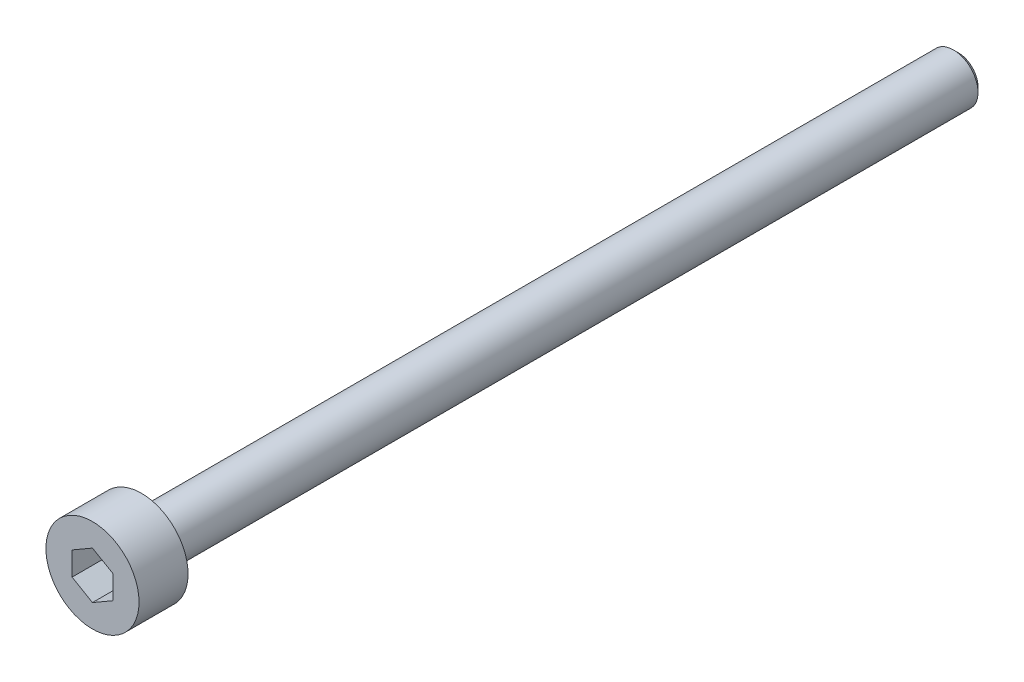
ISO-10303-21;
HEADER;
FILE_DESCRIPTION(('STEP AP214'),'2;1');
FILE_NAME('part.step','',(''),(''),'','','');
FILE_SCHEMA(('AUTOMOTIVE_DESIGN { 1 0 10303 214 1 1 1 1 }'));
ENDSEC;
DATA;
#1=APPLICATION_CONTEXT('core data for automotive mechanical design processes');
#2=APPLICATION_PROTOCOL_DEFINITION('international standard','automotive_design',2000,#1);
#3=PRODUCT_CONTEXT('',#1,'mechanical');
#4=PRODUCT('Part','Part','',(#3));
#5=PRODUCT_RELATED_PRODUCT_CATEGORY('part','',(#4));
#6=PRODUCT_DEFINITION_FORMATION('','',#4);
#7=PRODUCT_DEFINITION_CONTEXT('part definition',#1,'design');
#8=PRODUCT_DEFINITION('design','',#6,#7);
#9=PRODUCT_DEFINITION_SHAPE('','',#8);
#10=(LENGTH_UNIT() NAMED_UNIT(*) SI_UNIT(.MILLI.,.METRE.));
#11=(NAMED_UNIT(*) PLANE_ANGLE_UNIT() SI_UNIT($,.RADIAN.));
#12=(NAMED_UNIT(*) SI_UNIT($,.STERADIAN.) SOLID_ANGLE_UNIT());
#13=UNCERTAINTY_MEASURE_WITH_UNIT(LENGTH_MEASURE(1.E-05),#10,'distance_accuracy_value','');
#14=(GEOMETRIC_REPRESENTATION_CONTEXT(3) GLOBAL_UNCERTAINTY_ASSIGNED_CONTEXT((#13)) GLOBAL_UNIT_ASSIGNED_CONTEXT((#10,
#11,#12)) REPRESENTATION_CONTEXT('',''));
#15=CARTESIAN_POINT('',(0.,0.,0.));
#16=DIRECTION('',(0.,0.,1.));
#17=DIRECTION('',(1.,0.,0.));
#18=AXIS2_PLACEMENT_3D('',#15,#16,#17);
#19=CARTESIAN_POINT('',(0.,0.,3.));
#20=DIRECTION('',(0.,0.,-1.));
#21=DIRECTION('',(-1.,0.,0.));
#22=AXIS2_PLACEMENT_3D('',#19,#20,#21);
#23=CYLINDRICAL_SURFACE('',#22,2.85);
#24=CARTESIAN_POINT('',(0.,0.,3.));
#25=DIRECTION('',(0.,0.,1.));
#26=DIRECTION('',(1.,0.,0.));
#27=AXIS2_PLACEMENT_3D('',#24,#25,#26);
#28=CIRCLE('',#27,2.85);
#29=CARTESIAN_POINT('',(2.85,0.,3.));
#30=VERTEX_POINT('',#29);
#31=EDGE_CURVE('E146',#30,#30,#28,.T.);
#32=ORIENTED_EDGE('',*,*,#31,.F.);
#33=EDGE_LOOP('',(#32));
#34=FACE_BOUND('',#33,.T.);
#35=CARTESIAN_POINT('',(0.,0.,0.));
#36=DIRECTION('',(0.,0.,1.));
#37=DIRECTION('',(1.,0.,0.));
#38=AXIS2_PLACEMENT_3D('',#35,#36,#37);
#39=CIRCLE('',#38,2.85);
#40=CARTESIAN_POINT('',(2.85,0.,0.));
#41=VERTEX_POINT('',#40);
#42=EDGE_CURVE('E140',#41,#41,#39,.T.);
#43=ORIENTED_EDGE('',*,*,#42,.T.);
#44=EDGE_LOOP('',(#43));
#45=FACE_BOUND('',#44,.T.);
#46=ADVANCED_FACE('F38',(#34,#45),#23,.T.);
#47=CARTESIAN_POINT('',(0.,0.,3.));
#48=DIRECTION('',(0.,0.,1.));
#49=DIRECTION('',(1.,0.,0.));
#50=AXIS2_PLACEMENT_3D('',#47,#48,#49);
#51=PLANE('',#50);
#52=DIRECTION('',(-0.866025403784439,0.5,0.));
#53=VECTOR('',#52,1.);
#54=CARTESIAN_POINT('',(1.25,0.721687836487032,3.));
#55=LINE('',#54,#53);
#56=CARTESIAN_POINT('',(1.25,0.721687836487032,3.));
#57=VERTEX_POINT('',#56);
#58=CARTESIAN_POINT('',(0.,1.44337567297406,3.));
#59=VERTEX_POINT('',#58);
#60=EDGE_CURVE('E53',#57,#59,#55,.T.);
#61=ORIENTED_EDGE('',*,*,#60,.F.);
#62=DIRECTION('',(0.,1.,0.));
#63=VECTOR('',#62,1.);
#64=CARTESIAN_POINT('',(1.25,-0.721687836487032,3.));
#65=LINE('',#64,#63);
#66=CARTESIAN_POINT('',(1.25,-0.721687836487032,3.));
#67=VERTEX_POINT('',#66);
#68=EDGE_CURVE('E136',#67,#57,#65,.T.);
#69=ORIENTED_EDGE('',*,*,#68,.F.);
#70=DIRECTION('',(0.866025403784439,0.5,0.));
#71=VECTOR('',#70,1.);
#72=CARTESIAN_POINT('',(0.,-1.44337567297406,3.));
#73=LINE('',#72,#71);
#74=CARTESIAN_POINT('',(0.,-1.44337567297406,3.));
#75=VERTEX_POINT('',#74);
#76=EDGE_CURVE('E134',#75,#67,#73,.T.);
#77=ORIENTED_EDGE('',*,*,#76,.F.);
#78=DIRECTION('',(0.866025403784439,-0.5,0.));
#79=VECTOR('',#78,1.);
#80=CARTESIAN_POINT('',(-1.25,-0.721687836487033,3.));
#81=LINE('',#80,#79);
#82=CARTESIAN_POINT('',(-1.25,-0.721687836487033,3.));
#83=VERTEX_POINT('',#82);
#84=EDGE_CURVE('E101',#83,#75,#81,.T.);
#85=ORIENTED_EDGE('',*,*,#84,.F.);
#86=DIRECTION('',(0.,-1.,0.));
#87=VECTOR('',#86,1.);
#88=CARTESIAN_POINT('',(-1.25,0.721687836487032,3.));
#89=LINE('',#88,#87);
#90=CARTESIAN_POINT('',(-1.25,0.721687836487032,3.));
#91=VERTEX_POINT('',#90);
#92=EDGE_CURVE('E130',#91,#83,#89,.T.);
#93=ORIENTED_EDGE('',*,*,#92,.F.);
#94=DIRECTION('',(-0.866025403784439,-0.5,0.));
#95=VECTOR('',#94,1.);
#96=CARTESIAN_POINT('',(0.,1.44337567297406,3.));
#97=LINE('',#96,#95);
#98=EDGE_CURVE('E127',#59,#91,#97,.T.);
#99=ORIENTED_EDGE('',*,*,#98,.F.);
#100=EDGE_LOOP('',(#61,#69,#77,#85,#93,#99));
#101=FACE_BOUND('',#100,.T.);
#102=ORIENTED_EDGE('',*,*,#31,.T.);
#103=EDGE_LOOP('',(#102));
#104=FACE_BOUND('',#103,.T.);
#105=ADVANCED_FACE('F171',(#101,#104),#51,.T.);
#106=CARTESIAN_POINT('',(0.,0.,0.));
#107=DIRECTION('',(0.,0.,1.));
#108=DIRECTION('',(1.,0.,0.));
#109=AXIS2_PLACEMENT_3D('',#106,#107,#108);
#110=PLANE('',#109);
#111=CARTESIAN_POINT('',(0.,0.,0.));
#112=DIRECTION('',(0.,0.,1.));
#113=DIRECTION('',(1.,0.,0.));
#114=AXIS2_PLACEMENT_3D('',#111,#112,#113);
#115=CIRCLE('',#114,1.5);
#116=CARTESIAN_POINT('',(1.5,0.,0.));
#117=VERTEX_POINT('',#116);
#118=EDGE_CURVE('E149',#117,#117,#115,.F.);
#119=ORIENTED_EDGE('',*,*,#118,.F.);
#120=EDGE_LOOP('',(#119));
#121=FACE_BOUND('',#120,.T.);
#122=ORIENTED_EDGE('',*,*,#42,.F.);
#123=EDGE_LOOP('',(#122));
#124=FACE_BOUND('',#123,.T.);
#125=ADVANCED_FACE('F176',(#121,#124),#110,.F.);
#126=CARTESIAN_POINT('',(0.,0.,-50.));
#127=DIRECTION('',(0.,0.,1.));
#128=DIRECTION('',(1.,0.,0.));
#129=AXIS2_PLACEMENT_3D('',#126,#127,#128);
#130=CYLINDRICAL_SURFACE('',#129,1.5);
#131=CARTESIAN_POINT('',(0.,0.,-49.7));
#132=DIRECTION('',(0.,0.,-1.));
#133=DIRECTION('',(-1.,0.,0.));
#134=AXIS2_PLACEMENT_3D('',#131,#132,#133);
#135=CIRCLE('',#134,1.5);
#136=CARTESIAN_POINT('',(-1.5,0.,-49.7));
#137=VERTEX_POINT('',#136);
#138=EDGE_CURVE('E11',#137,#137,#135,.F.);
#139=ORIENTED_EDGE('',*,*,#138,.T.);
#140=EDGE_LOOP('',(#139));
#141=FACE_BOUND('',#140,.T.);
#142=ORIENTED_EDGE('',*,*,#118,.T.);
#143=EDGE_LOOP('',(#142));
#144=FACE_BOUND('',#143,.T.);
#145=ADVANCED_FACE('F167',(#141,#144),#130,.T.);
#146=CARTESIAN_POINT('',(0.,0.,-50.));
#147=DIRECTION('',(0.,0.,-1.));
#148=DIRECTION('',(-1.,0.,0.));
#149=AXIS2_PLACEMENT_3D('',#146,#147,#148);
#150=PLANE('',#149);
#151=CARTESIAN_POINT('',(0.,0.,-50.));
#152=DIRECTION('',(0.,0.,-1.));
#153=DIRECTION('',(-1.,0.,0.));
#154=AXIS2_PLACEMENT_3D('',#151,#152,#153);
#155=CIRCLE('',#154,1.2);
#156=CARTESIAN_POINT('',(-1.2,0.,-50.));
#157=VERTEX_POINT('',#156);
#158=EDGE_CURVE('E46',#157,#157,#155,.T.);
#159=ORIENTED_EDGE('',*,*,#158,.T.);
#160=EDGE_LOOP('',(#159));
#161=FACE_BOUND('',#160,.T.);
#162=ADVANCED_FACE('F156',(#161),#150,.T.);
#163=CARTESIAN_POINT('',(0.,0.,-50.));
#164=DIRECTION('',(0.,0.,1.));
#165=DIRECTION('',(1.,0.,0.));
#166=AXIS2_PLACEMENT_3D('',#163,#164,#165);
#167=CONICAL_SURFACE('',#166,1.2,0.785398163397447);
#168=ORIENTED_EDGE('',*,*,#138,.F.);
#169=EDGE_LOOP('',(#168));
#170=FACE_BOUND('',#169,.T.);
#171=ORIENTED_EDGE('',*,*,#158,.F.);
#172=EDGE_LOOP('',(#171));
#173=FACE_BOUND('',#172,.T.);
#174=ADVANCED_FACE('F40',(#170,#173),#167,.T.);
#175=CARTESIAN_POINT('',(1.25,0.721687836487032,1.));
#176=DIRECTION('',(0.5,0.866025403784439,0.));
#177=DIRECTION('',(-0.866025403784439,0.5,0.));
#178=AXIS2_PLACEMENT_3D('',#175,#176,#177);
#179=PLANE('',#178);
#180=ORIENTED_EDGE('',*,*,#60,.T.);
#181=DIRECTION('',(0.,0.,1.));
#182=VECTOR('',#181,1.);
#183=CARTESIAN_POINT('',(0.,1.44337567297406,1.));
#184=LINE('',#183,#182);
#185=CARTESIAN_POINT('',(0.,1.44337567297406,1.));
#186=VERTEX_POINT('',#185);
#187=EDGE_CURVE('E83',#186,#59,#184,.T.);
#188=ORIENTED_EDGE('',*,*,#187,.F.);
#189=DIRECTION('',(-0.866025403784439,0.5,0.));
#190=VECTOR('',#189,1.);
#191=CARTESIAN_POINT('',(1.25,0.721687836487032,1.));
#192=LINE('',#191,#190);
#193=CARTESIAN_POINT('',(1.25,0.721687836487032,1.));
#194=VERTEX_POINT('',#193);
#195=EDGE_CURVE('E138',#194,#186,#192,.T.);
#196=ORIENTED_EDGE('',*,*,#195,.F.);
#197=DIRECTION('',(0.,0.,1.));
#198=VECTOR('',#197,1.);
#199=CARTESIAN_POINT('',(1.25,0.721687836487032,1.));
#200=LINE('',#199,#198);
#201=EDGE_CURVE('E61',#194,#57,#200,.T.);
#202=ORIENTED_EDGE('',*,*,#201,.T.);
#203=EDGE_LOOP('',(#180,#188,#196,#202));
#204=FACE_BOUND('',#203,.T.);
#205=ADVANCED_FACE('F159',(#204),#179,.F.);
#206=CARTESIAN_POINT('',(1.25,-0.721687836487032,1.));
#207=DIRECTION('',(1.,0.,0.));
#208=DIRECTION('',(0.,1.,0.));
#209=AXIS2_PLACEMENT_3D('',#206,#207,#208);
#210=PLANE('',#209);
#211=ORIENTED_EDGE('',*,*,#68,.T.);
#212=ORIENTED_EDGE('',*,*,#201,.F.);
#213=DIRECTION('',(0.,1.,0.));
#214=VECTOR('',#213,1.);
#215=CARTESIAN_POINT('',(1.25,-0.721687836487032,1.));
#216=LINE('',#215,#214);
#217=CARTESIAN_POINT('',(1.25,-0.721687836487032,1.));
#218=VERTEX_POINT('',#217);
#219=EDGE_CURVE('E113',#218,#194,#216,.T.);
#220=ORIENTED_EDGE('',*,*,#219,.F.);
#221=DIRECTION('',(0.,0.,1.));
#222=VECTOR('',#221,1.);
#223=CARTESIAN_POINT('',(1.25,-0.721687836487032,1.));
#224=LINE('',#223,#222);
#225=EDGE_CURVE('E105',#218,#67,#224,.T.);
#226=ORIENTED_EDGE('',*,*,#225,.T.);
#227=EDGE_LOOP('',(#211,#212,#220,#226));
#228=FACE_BOUND('',#227,.T.);
#229=ADVANCED_FACE('F165',(#228),#210,.F.);
#230=CARTESIAN_POINT('',(0.,-1.44337567297406,1.));
#231=DIRECTION('',(0.5,-0.866025403784439,0.));
#232=DIRECTION('',(0.866025403784439,0.5,0.));
#233=AXIS2_PLACEMENT_3D('',#230,#231,#232);
#234=PLANE('',#233);
#235=ORIENTED_EDGE('',*,*,#76,.T.);
#236=ORIENTED_EDGE('',*,*,#225,.F.);
#237=DIRECTION('',(0.866025403784439,0.5,0.));
#238=VECTOR('',#237,1.);
#239=CARTESIAN_POINT('',(0.,-1.44337567297406,1.));
#240=LINE('',#239,#238);
#241=CARTESIAN_POINT('',(0.,-1.44337567297406,1.));
#242=VERTEX_POINT('',#241);
#243=EDGE_CURVE('E109',#242,#218,#240,.T.);
#244=ORIENTED_EDGE('',*,*,#243,.F.);
#245=DIRECTION('',(0.,0.,1.));
#246=VECTOR('',#245,1.);
#247=CARTESIAN_POINT('',(0.,-1.44337567297406,1.));
#248=LINE('',#247,#246);
#249=EDGE_CURVE('E94',#242,#75,#248,.T.);
#250=ORIENTED_EDGE('',*,*,#249,.T.);
#251=EDGE_LOOP('',(#235,#236,#244,#250));
#252=FACE_BOUND('',#251,.T.);
#253=ADVANCED_FACE('F110',(#252),#234,.F.);
#254=CARTESIAN_POINT('',(-1.25,-0.721687836487033,1.));
#255=DIRECTION('',(-0.5,-0.866025403784439,0.));
#256=DIRECTION('',(0.866025403784439,-0.5,0.));
#257=AXIS2_PLACEMENT_3D('',#254,#255,#256);
#258=PLANE('',#257);
#259=ORIENTED_EDGE('',*,*,#84,.T.);
#260=ORIENTED_EDGE('',*,*,#249,.F.);
#261=DIRECTION('',(0.866025403784439,-0.5,0.));
#262=VECTOR('',#261,1.);
#263=CARTESIAN_POINT('',(-1.25,-0.721687836487033,1.));
#264=LINE('',#263,#262);
#265=CARTESIAN_POINT('',(-1.25,-0.721687836487033,1.));
#266=VERTEX_POINT('',#265);
#267=EDGE_CURVE('E98',#266,#242,#264,.T.);
#268=ORIENTED_EDGE('',*,*,#267,.F.);
#269=DIRECTION('',(0.,0.,1.));
#270=VECTOR('',#269,1.);
#271=CARTESIAN_POINT('',(-1.25,-0.721687836487033,1.));
#272=LINE('',#271,#270);
#273=EDGE_CURVE('E106',#266,#83,#272,.T.);
#274=ORIENTED_EDGE('',*,*,#273,.T.);
#275=EDGE_LOOP('',(#259,#260,#268,#274));
#276=FACE_BOUND('',#275,.T.);
#277=ADVANCED_FACE('F96',(#276),#258,.F.);
#278=CARTESIAN_POINT('',(-1.25,0.721687836487032,1.));
#279=DIRECTION('',(-1.,0.,0.));
#280=DIRECTION('',(0.,0.,1.));
#281=AXIS2_PLACEMENT_3D('',#278,#279,#280);
#282=PLANE('',#281);
#283=ORIENTED_EDGE('',*,*,#92,.T.);
#284=ORIENTED_EDGE('',*,*,#273,.F.);
#285=DIRECTION('',(0.,-1.,0.));
#286=VECTOR('',#285,1.);
#287=CARTESIAN_POINT('',(-1.25,0.721687836487032,1.));
#288=LINE('',#287,#286);
#289=CARTESIAN_POINT('',(-1.25,0.721687836487032,1.));
#290=VERTEX_POINT('',#289);
#291=EDGE_CURVE('E119',#290,#266,#288,.T.);
#292=ORIENTED_EDGE('',*,*,#291,.F.);
#293=DIRECTION('',(0.,0.,1.));
#294=VECTOR('',#293,1.);
#295=CARTESIAN_POINT('',(-1.25,0.721687836487032,1.));
#296=LINE('',#295,#294);
#297=EDGE_CURVE('E143',#290,#91,#296,.T.);
#298=ORIENTED_EDGE('',*,*,#297,.T.);
#299=EDGE_LOOP('',(#283,#284,#292,#298));
#300=FACE_BOUND('',#299,.T.);
#301=ADVANCED_FACE('F191',(#300),#282,.F.);
#302=CARTESIAN_POINT('',(0.,1.44337567297406,1.));
#303=DIRECTION('',(-0.5,0.866025403784439,0.));
#304=DIRECTION('',(-0.866025403784439,-0.5,0.));
#305=AXIS2_PLACEMENT_3D('',#302,#303,#304);
#306=PLANE('',#305);
#307=ORIENTED_EDGE('',*,*,#98,.T.);
#308=ORIENTED_EDGE('',*,*,#297,.F.);
#309=DIRECTION('',(-0.866025403784439,-0.5,0.));
#310=VECTOR('',#309,1.);
#311=CARTESIAN_POINT('',(0.,1.44337567297406,1.));
#312=LINE('',#311,#310);
#313=EDGE_CURVE('E121',#186,#290,#312,.T.);
#314=ORIENTED_EDGE('',*,*,#313,.F.);
#315=ORIENTED_EDGE('',*,*,#187,.T.);
#316=EDGE_LOOP('',(#307,#308,#314,#315));
#317=FACE_BOUND('',#316,.T.);
#318=ADVANCED_FACE('F188',(#317),#306,.F.);
#319=CARTESIAN_POINT('',(0.,0.,1.));
#320=DIRECTION('',(0.,0.,1.));
#321=DIRECTION('',(1.,0.,0.));
#322=AXIS2_PLACEMENT_3D('',#319,#320,#321);
#323=PLANE('',#322);
#324=ORIENTED_EDGE('',*,*,#195,.T.);
#325=ORIENTED_EDGE('',*,*,#313,.T.);
#326=ORIENTED_EDGE('',*,*,#291,.T.);
#327=ORIENTED_EDGE('',*,*,#267,.T.);
#328=ORIENTED_EDGE('',*,*,#243,.T.);
#329=ORIENTED_EDGE('',*,*,#219,.T.);
#330=EDGE_LOOP('',(#324,#325,#326,#327,#328,#329));
#331=FACE_BOUND('',#330,.T.);
#332=ADVANCED_FACE('F116',(#331),#323,.T.);
#333=CLOSED_SHELL('',(#46,#105,#125,#145,#162,#174,#205,#229,#253,#277,#301,#318,#332));
#334=MANIFOLD_SOLID_BREP('B2',#333);
#335=ADVANCED_BREP_SHAPE_REPRESENTATION('',(#18,#334),#14);
#336=SHAPE_DEFINITION_REPRESENTATION(#9,#335);
ENDSEC;
END-ISO-10303-21;
